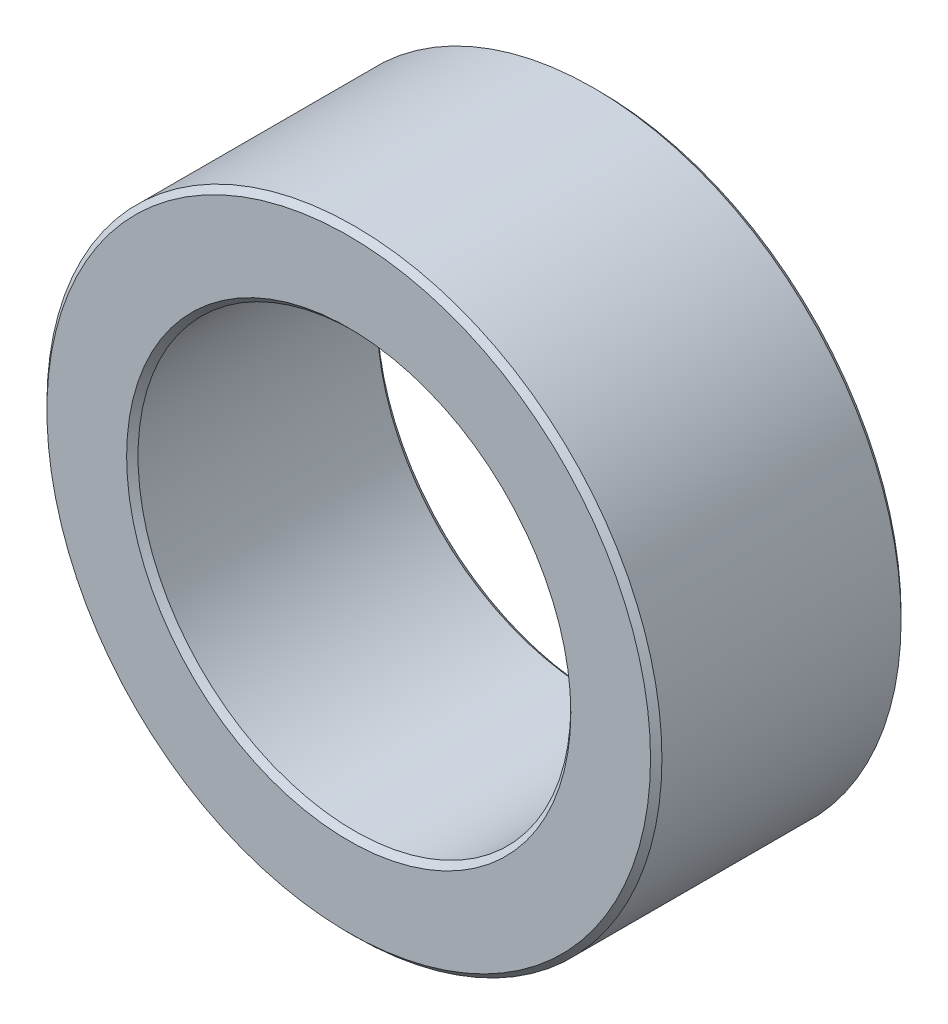
ISO-10303-21;
HEADER;
FILE_DESCRIPTION(('STEP AP214'),'2;1');
FILE_NAME('part.step','',(''),(''),'','','');
FILE_SCHEMA(('AUTOMOTIVE_DESIGN { 1 0 10303 214 1 1 1 1 }'));
ENDSEC;
DATA;
#1=APPLICATION_CONTEXT('core data for automotive mechanical design processes');
#2=APPLICATION_PROTOCOL_DEFINITION('international standard','automotive_design',2000,#1);
#3=PRODUCT_CONTEXT('',#1,'mechanical');
#4=PRODUCT('Part','Part','',(#3));
#5=PRODUCT_RELATED_PRODUCT_CATEGORY('part','',(#4));
#6=PRODUCT_DEFINITION_FORMATION('','',#4);
#7=PRODUCT_DEFINITION_CONTEXT('part definition',#1,'design');
#8=PRODUCT_DEFINITION('design','',#6,#7);
#9=PRODUCT_DEFINITION_SHAPE('','',#8);
#10=(LENGTH_UNIT() NAMED_UNIT(*) SI_UNIT(.MILLI.,.METRE.));
#11=(NAMED_UNIT(*) PLANE_ANGLE_UNIT() SI_UNIT($,.RADIAN.));
#12=(NAMED_UNIT(*) SI_UNIT($,.STERADIAN.) SOLID_ANGLE_UNIT());
#13=UNCERTAINTY_MEASURE_WITH_UNIT(LENGTH_MEASURE(1.E-05),#10,'distance_accuracy_value','');
#14=(GEOMETRIC_REPRESENTATION_CONTEXT(3) GLOBAL_UNCERTAINTY_ASSIGNED_CONTEXT((#13)) GLOBAL_UNIT_ASSIGNED_CONTEXT((#10,
#11,#12)) REPRESENTATION_CONTEXT('',''));
#15=CARTESIAN_POINT('',(0.,0.,0.));
#16=DIRECTION('',(0.,0.,1.));
#17=DIRECTION('',(1.,0.,0.));
#18=AXIS2_PLACEMENT_3D('',#15,#16,#17);
#19=CARTESIAN_POINT('',(0.,0.,11.));
#20=DIRECTION('',(0.,0.,1.));
#21=DIRECTION('',(1.,0.,0.));
#22=AXIS2_PLACEMENT_3D('',#19,#20,#21);
#23=PLANE('',#22);
#24=CARTESIAN_POINT('',(0.,0.,11.));
#25=DIRECTION('',(0.,0.,1.));
#26=DIRECTION('',(1.,0.,0.));
#27=AXIS2_PLACEMENT_3D('',#24,#25,#26);
#28=CIRCLE('',#27,26.5);
#29=CARTESIAN_POINT('',(26.5,0.,11.));
#30=VERTEX_POINT('',#29);
#31=EDGE_CURVE('E10',#30,#30,#28,.T.);
#32=ORIENTED_EDGE('',*,*,#31,.T.);
#33=EDGE_LOOP('',(#32));
#34=FACE_BOUND('',#33,.T.);
#35=CARTESIAN_POINT('',(0.,0.,11.));
#36=DIRECTION('',(0.,0.,1.));
#37=DIRECTION('',(1.,0.,0.));
#38=AXIS2_PLACEMENT_3D('',#35,#36,#37);
#39=CIRCLE('',#38,19.5);
#40=CARTESIAN_POINT('',(19.5,0.,11.));
#41=VERTEX_POINT('',#40);
#42=EDGE_CURVE('E54',#41,#41,#39,.F.);
#43=ORIENTED_EDGE('',*,*,#42,.T.);
#44=EDGE_LOOP('',(#43));
#45=FACE_BOUND('',#44,.T.);
#46=ADVANCED_FACE('F45',(#34,#45),#23,.T.);
#47=CARTESIAN_POINT('',(0.,0.,-11.));
#48=DIRECTION('',(0.,0.,1.));
#49=DIRECTION('',(1.,0.,0.));
#50=AXIS2_PLACEMENT_3D('',#47,#48,#49);
#51=PLANE('',#50);
#52=CARTESIAN_POINT('',(0.,0.,-11.));
#53=DIRECTION('',(0.,0.,1.));
#54=DIRECTION('',(1.,0.,0.));
#55=AXIS2_PLACEMENT_3D('',#52,#53,#54);
#56=CIRCLE('',#55,19.5);
#57=CARTESIAN_POINT('',(19.5,0.,-11.));
#58=VERTEX_POINT('',#57);
#59=EDGE_CURVE('E78',#58,#58,#56,.T.);
#60=ORIENTED_EDGE('',*,*,#59,.T.);
#61=EDGE_LOOP('',(#60));
#62=FACE_BOUND('',#61,.T.);
#63=CARTESIAN_POINT('',(0.,0.,-11.));
#64=DIRECTION('',(0.,0.,1.));
#65=DIRECTION('',(1.,0.,0.));
#66=AXIS2_PLACEMENT_3D('',#63,#64,#65);
#67=CIRCLE('',#66,26.5);
#68=CARTESIAN_POINT('',(26.5,0.,-11.));
#69=VERTEX_POINT('',#68);
#70=EDGE_CURVE('E82',#69,#69,#67,.F.);
#71=ORIENTED_EDGE('',*,*,#70,.T.);
#72=EDGE_LOOP('',(#71));
#73=FACE_BOUND('',#72,.T.);
#74=ADVANCED_FACE('F87',(#62,#73),#51,.F.);
#75=CARTESIAN_POINT('',(0.,0.,11.));
#76=DIRECTION('',(0.,0.,-1.));
#77=DIRECTION('',(-1.,0.,0.));
#78=AXIS2_PLACEMENT_3D('',#75,#76,#77);
#79=CYLINDRICAL_SURFACE('',#78,27.);
#80=CARTESIAN_POINT('',(0.,0.,-10.5));
#81=DIRECTION('',(0.,0.,1.));
#82=DIRECTION('',(1.,0.,0.));
#83=AXIS2_PLACEMENT_3D('',#80,#81,#82);
#84=CIRCLE('',#83,27.);
#85=CARTESIAN_POINT('',(27.,0.,-10.5));
#86=VERTEX_POINT('',#85);
#87=EDGE_CURVE('E59',#86,#86,#84,.T.);
#88=ORIENTED_EDGE('',*,*,#87,.T.);
#89=EDGE_LOOP('',(#88));
#90=FACE_BOUND('',#89,.T.);
#91=CARTESIAN_POINT('',(0.,0.,10.5));
#92=DIRECTION('',(0.,0.,1.));
#93=DIRECTION('',(1.,0.,0.));
#94=AXIS2_PLACEMENT_3D('',#91,#92,#93);
#95=CIRCLE('',#94,27.);
#96=CARTESIAN_POINT('',(27.,0.,10.5));
#97=VERTEX_POINT('',#96);
#98=EDGE_CURVE('E64',#97,#97,#95,.F.);
#99=ORIENTED_EDGE('',*,*,#98,.T.);
#100=EDGE_LOOP('',(#99));
#101=FACE_BOUND('',#100,.T.);
#102=ADVANCED_FACE('F97',(#90,#101),#79,.T.);
#103=CARTESIAN_POINT('',(0.,0.,11.));
#104=DIRECTION('',(0.,0.,-1.));
#105=DIRECTION('',(-1.,0.,0.));
#106=AXIS2_PLACEMENT_3D('',#103,#104,#105);
#107=CYLINDRICAL_SURFACE('',#106,19.);
#108=CARTESIAN_POINT('',(0.,0.,-10.5));
#109=DIRECTION('',(0.,0.,1.));
#110=DIRECTION('',(1.,0.,0.));
#111=AXIS2_PLACEMENT_3D('',#108,#109,#110);
#112=CIRCLE('',#111,19.);
#113=CARTESIAN_POINT('',(19.,0.,-10.5));
#114=VERTEX_POINT('',#113);
#115=EDGE_CURVE('E70',#114,#114,#112,.F.);
#116=ORIENTED_EDGE('',*,*,#115,.T.);
#117=EDGE_LOOP('',(#116));
#118=FACE_BOUND('',#117,.T.);
#119=CARTESIAN_POINT('',(0.,0.,10.5));
#120=DIRECTION('',(0.,0.,1.));
#121=DIRECTION('',(1.,0.,0.));
#122=AXIS2_PLACEMENT_3D('',#119,#120,#121);
#123=CIRCLE('',#122,19.);
#124=CARTESIAN_POINT('',(19.,0.,10.5));
#125=VERTEX_POINT('',#124);
#126=EDGE_CURVE('E74',#125,#125,#123,.T.);
#127=ORIENTED_EDGE('',*,*,#126,.T.);
#128=EDGE_LOOP('',(#127));
#129=FACE_BOUND('',#128,.T.);
#130=ADVANCED_FACE('F100',(#118,#129),#107,.F.);
#131=CARTESIAN_POINT('',(0.,0.,-11.));
#132=DIRECTION('',(0.,0.,-1.));
#133=DIRECTION('',(-1.,0.,0.));
#134=AXIS2_PLACEMENT_3D('',#131,#132,#133);
#135=CONICAL_SURFACE('',#134,19.5,0.785398163397445);
#136=ORIENTED_EDGE('',*,*,#115,.F.);
#137=EDGE_LOOP('',(#136));
#138=FACE_BOUND('',#137,.T.);
#139=ORIENTED_EDGE('',*,*,#59,.F.);
#140=EDGE_LOOP('',(#139));
#141=FACE_BOUND('',#140,.T.);
#142=ADVANCED_FACE('F93',(#138,#141),#135,.F.);
#143=CARTESIAN_POINT('',(0.,0.,-10.5));
#144=DIRECTION('',(0.,0.,1.));
#145=DIRECTION('',(1.,0.,0.));
#146=AXIS2_PLACEMENT_3D('',#143,#144,#145);
#147=CONICAL_SURFACE('',#146,27.,0.785398163397448);
#148=ORIENTED_EDGE('',*,*,#70,.F.);
#149=EDGE_LOOP('',(#148));
#150=FACE_BOUND('',#149,.T.);
#151=ORIENTED_EDGE('',*,*,#87,.F.);
#152=EDGE_LOOP('',(#151));
#153=FACE_BOUND('',#152,.T.);
#154=ADVANCED_FACE('F89',(#150,#153),#147,.T.);
#155=CARTESIAN_POINT('',(0.,0.,11.));
#156=DIRECTION('',(0.,0.,-1.));
#157=DIRECTION('',(-1.,0.,0.));
#158=AXIS2_PLACEMENT_3D('',#155,#156,#157);
#159=CONICAL_SURFACE('',#158,26.5,0.785398163397441);
#160=ORIENTED_EDGE('',*,*,#98,.F.);
#161=EDGE_LOOP('',(#160));
#162=FACE_BOUND('',#161,.T.);
#163=ORIENTED_EDGE('',*,*,#31,.F.);
#164=EDGE_LOOP('',(#163));
#165=FACE_BOUND('',#164,.T.);
#166=ADVANCED_FACE('F92',(#162,#165),#159,.T.);
#167=CARTESIAN_POINT('',(0.,0.,10.5));
#168=DIRECTION('',(0.,0.,1.));
#169=DIRECTION('',(1.,0.,0.));
#170=AXIS2_PLACEMENT_3D('',#167,#168,#169);
#171=CONICAL_SURFACE('',#170,19.,0.785398163397452);
#172=ORIENTED_EDGE('',*,*,#42,.F.);
#173=EDGE_LOOP('',(#172));
#174=FACE_BOUND('',#173,.T.);
#175=ORIENTED_EDGE('',*,*,#126,.F.);
#176=EDGE_LOOP('',(#175));
#177=FACE_BOUND('',#176,.T.);
#178=ADVANCED_FACE('F48',(#174,#177),#171,.F.);
#179=CLOSED_SHELL('',(#46,#74,#102,#130,#142,#154,#166,#178));
#180=MANIFOLD_SOLID_BREP('B2',#179);
#181=ADVANCED_BREP_SHAPE_REPRESENTATION('',(#18,#180),#14);
#182=SHAPE_DEFINITION_REPRESENTATION(#9,#181);
ENDSEC;
END-ISO-10303-21;
